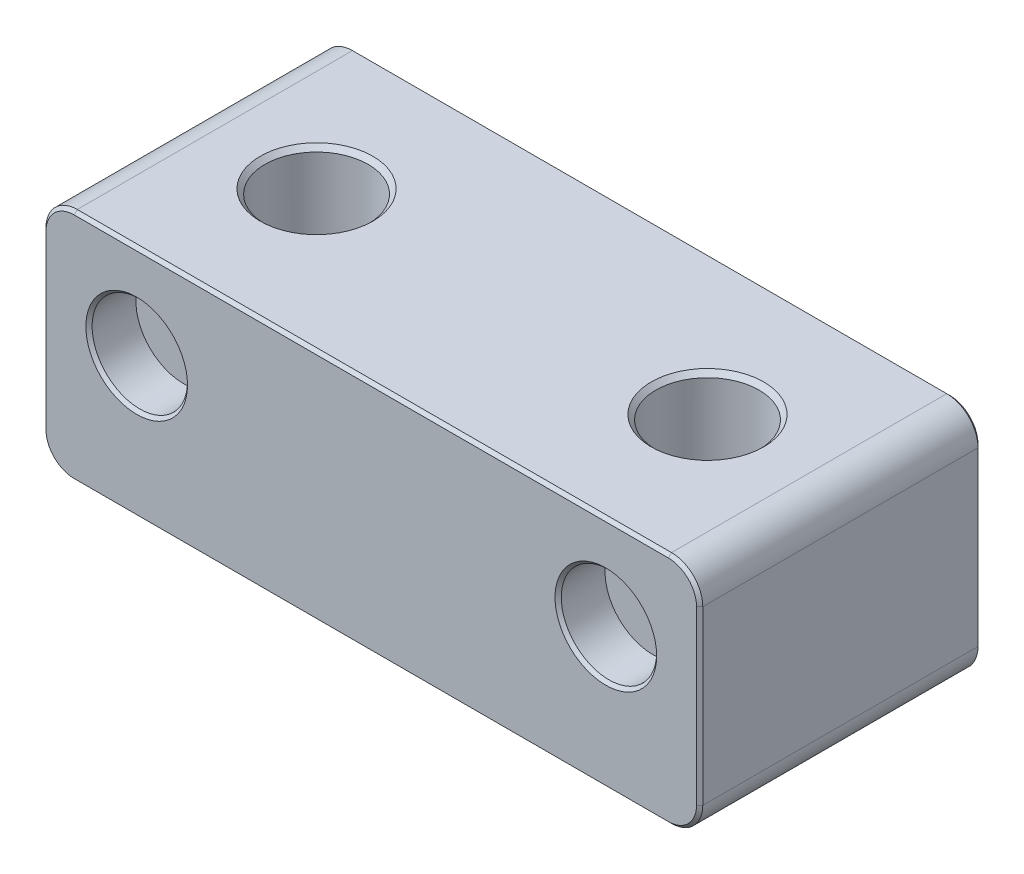
ISO-10303-21;
HEADER;
FILE_DESCRIPTION(('STEP AP214'),'2;1');
FILE_NAME('part.step','',(''),(''),'','','');
FILE_SCHEMA(('AUTOMOTIVE_DESIGN { 1 0 10303 214 1 1 1 1 }'));
ENDSEC;
DATA;
#1=APPLICATION_CONTEXT('core data for automotive mechanical design processes');
#2=APPLICATION_PROTOCOL_DEFINITION('international standard','automotive_design',2000,#1);
#3=PRODUCT_CONTEXT('',#1,'mechanical');
#4=PRODUCT('Part','Part','',(#3));
#5=PRODUCT_RELATED_PRODUCT_CATEGORY('part','',(#4));
#6=PRODUCT_DEFINITION_FORMATION('','',#4);
#7=PRODUCT_DEFINITION_CONTEXT('part definition',#1,'design');
#8=PRODUCT_DEFINITION('design','',#6,#7);
#9=PRODUCT_DEFINITION_SHAPE('','',#8);
#10=(LENGTH_UNIT() NAMED_UNIT(*) SI_UNIT(.MILLI.,.METRE.));
#11=(NAMED_UNIT(*) PLANE_ANGLE_UNIT() SI_UNIT($,.RADIAN.));
#12=(NAMED_UNIT(*) SI_UNIT($,.STERADIAN.) SOLID_ANGLE_UNIT());
#13=UNCERTAINTY_MEASURE_WITH_UNIT(LENGTH_MEASURE(1.E-05),#10,'distance_accuracy_value','');
#14=(GEOMETRIC_REPRESENTATION_CONTEXT(3) GLOBAL_UNCERTAINTY_ASSIGNED_CONTEXT((#13)) GLOBAL_UNIT_ASSIGNED_CONTEXT((#10,
#11,#12)) REPRESENTATION_CONTEXT('',''));
#15=CARTESIAN_POINT('',(0.,0.,0.));
#16=DIRECTION('',(0.,0.,1.));
#17=DIRECTION('',(1.,0.,0.));
#18=AXIS2_PLACEMENT_3D('',#15,#16,#17);
#19=CARTESIAN_POINT('',(0.,0.,9.));
#20=DIRECTION('',(0.,0.,1.));
#21=DIRECTION('',(1.,0.,0.));
#22=AXIS2_PLACEMENT_3D('',#19,#20,#21);
#23=PLANE('',#22);
#24=CARTESIAN_POINT('',(15.,0.,9.));
#25=DIRECTION('',(0.,0.,1.));
#26=DIRECTION('',(1.,0.,0.));
#27=AXIS2_PLACEMENT_3D('',#24,#25,#26);
#28=CIRCLE('',#27,3.25);
#29=CARTESIAN_POINT('',(18.25,0.,9.));
#30=VERTEX_POINT('',#29);
#31=EDGE_CURVE('E215',#30,#30,#28,.F.);
#32=ORIENTED_EDGE('',*,*,#31,.T.);
#33=EDGE_LOOP('',(#32));
#34=FACE_BOUND('',#33,.T.);
#35=DIRECTION('',(0.,-1.,0.));
#36=VECTOR('',#35,1.);
#37=CARTESIAN_POINT('',(-20.8,-7.,9.));
#38=LINE('',#37,#36);
#39=CARTESIAN_POINT('',(-20.8,4.,9.));
#40=VERTEX_POINT('',#39);
#41=CARTESIAN_POINT('',(-20.8,-7.,9.));
#42=VERTEX_POINT('',#41);
#43=EDGE_CURVE('E33',#40,#42,#38,.T.);
#44=ORIENTED_EDGE('',*,*,#43,.T.);
#45=CARTESIAN_POINT('',(-19.,-7.,9.));
#46=DIRECTION('',(0.,0.,1.));
#47=DIRECTION('',(1.,0.,0.));
#48=AXIS2_PLACEMENT_3D('',#45,#46,#47);
#49=CIRCLE('',#48,1.8);
#50=CARTESIAN_POINT('',(-19.,-8.8,9.));
#51=VERTEX_POINT('',#50);
#52=EDGE_CURVE('E213',#42,#51,#49,.T.);
#53=ORIENTED_EDGE('',*,*,#52,.T.);
#54=DIRECTION('',(1.,0.,0.));
#55=VECTOR('',#54,1.);
#56=CARTESIAN_POINT('',(0.,-8.8,9.));
#57=LINE('',#56,#55);
#58=CARTESIAN_POINT('',(19.,-8.8,9.));
#59=VERTEX_POINT('',#58);
#60=EDGE_CURVE('E201',#51,#59,#57,.T.);
#61=ORIENTED_EDGE('',*,*,#60,.T.);
#62=CARTESIAN_POINT('',(19.,-7.,9.));
#63=DIRECTION('',(0.,0.,1.));
#64=DIRECTION('',(1.,0.,0.));
#65=AXIS2_PLACEMENT_3D('',#62,#63,#64);
#66=CIRCLE('',#65,1.8);
#67=CARTESIAN_POINT('',(20.8,-7.,9.));
#68=VERTEX_POINT('',#67);
#69=EDGE_CURVE('E203',#59,#68,#66,.T.);
#70=ORIENTED_EDGE('',*,*,#69,.T.);
#71=DIRECTION('',(0.,1.,0.));
#72=VECTOR('',#71,1.);
#73=CARTESIAN_POINT('',(20.8,4.,9.));
#74=LINE('',#73,#72);
#75=CARTESIAN_POINT('',(20.8,4.,9.));
#76=VERTEX_POINT('',#75);
#77=EDGE_CURVE('E205',#68,#76,#74,.T.);
#78=ORIENTED_EDGE('',*,*,#77,.T.);
#79=CARTESIAN_POINT('',(19.,4.,9.));
#80=DIRECTION('',(0.,0.,1.));
#81=DIRECTION('',(1.,0.,0.));
#82=AXIS2_PLACEMENT_3D('',#79,#80,#81);
#83=CIRCLE('',#82,1.8);
#84=CARTESIAN_POINT('',(19.,5.8,9.));
#85=VERTEX_POINT('',#84);
#86=EDGE_CURVE('E207',#76,#85,#83,.T.);
#87=ORIENTED_EDGE('',*,*,#86,.T.);
#88=DIRECTION('',(-1.,0.,0.));
#89=VECTOR('',#88,1.);
#90=CARTESIAN_POINT('',(-19.,5.8,9.));
#91=LINE('',#90,#89);
#92=CARTESIAN_POINT('',(-19.,5.8,9.));
#93=VERTEX_POINT('',#92);
#94=EDGE_CURVE('E209',#85,#93,#91,.T.);
#95=ORIENTED_EDGE('',*,*,#94,.T.);
#96=CARTESIAN_POINT('',(-19.,4.,9.));
#97=DIRECTION('',(0.,0.,1.));
#98=DIRECTION('',(1.,0.,0.));
#99=AXIS2_PLACEMENT_3D('',#96,#97,#98);
#100=CIRCLE('',#99,1.8);
#101=EDGE_CURVE('E38',#93,#40,#100,.T.);
#102=ORIENTED_EDGE('',*,*,#101,.T.);
#103=EDGE_LOOP('',(#44,#53,#61,#70,#78,#87,#95,#102));
#104=FACE_BOUND('',#103,.T.);
#105=CARTESIAN_POINT('',(-15.,0.,9.));
#106=DIRECTION('',(0.,0.,1.));
#107=DIRECTION('',(1.,0.,0.));
#108=AXIS2_PLACEMENT_3D('',#105,#106,#107);
#109=CIRCLE('',#108,3.25);
#110=CARTESIAN_POINT('',(-11.75,0.,9.));
#111=VERTEX_POINT('',#110);
#112=EDGE_CURVE('E198',#111,#111,#109,.F.);
#113=ORIENTED_EDGE('',*,*,#112,.T.);
#114=EDGE_LOOP('',(#113));
#115=FACE_BOUND('',#114,.T.);
#116=ADVANCED_FACE('F17',(#34,#104,#115),#23,.T.);
#117=CARTESIAN_POINT('',(0.,0.,-9.));
#118=DIRECTION('',(0.,0.,1.));
#119=DIRECTION('',(1.,0.,0.));
#120=AXIS2_PLACEMENT_3D('',#117,#118,#119);
#121=PLANE('',#120);
#122=DIRECTION('',(1.,0.,0.));
#123=VECTOR('',#122,1.);
#124=CARTESIAN_POINT('',(0.,5.8,-9.));
#125=LINE('',#124,#123);
#126=CARTESIAN_POINT('',(-19.,5.8,-9.));
#127=VERTEX_POINT('',#126);
#128=CARTESIAN_POINT('',(19.,5.8,-9.));
#129=VERTEX_POINT('',#128);
#130=EDGE_CURVE('E156',#127,#129,#125,.T.);
#131=ORIENTED_EDGE('',*,*,#130,.T.);
#132=CARTESIAN_POINT('',(19.,4.,-9.));
#133=DIRECTION('',(0.,0.,1.));
#134=DIRECTION('',(1.,0.,0.));
#135=AXIS2_PLACEMENT_3D('',#132,#133,#134);
#136=CIRCLE('',#135,1.8);
#137=CARTESIAN_POINT('',(20.8,4.,-9.));
#138=VERTEX_POINT('',#137);
#139=EDGE_CURVE('E136',#129,#138,#136,.F.);
#140=ORIENTED_EDGE('',*,*,#139,.T.);
#141=DIRECTION('',(0.,-1.,0.));
#142=VECTOR('',#141,1.);
#143=CARTESIAN_POINT('',(20.8,0.,-9.));
#144=LINE('',#143,#142);
#145=CARTESIAN_POINT('',(20.8,-7.,-9.));
#146=VERTEX_POINT('',#145);
#147=EDGE_CURVE('E145',#138,#146,#144,.T.);
#148=ORIENTED_EDGE('',*,*,#147,.T.);
#149=CARTESIAN_POINT('',(19.,-7.,-9.));
#150=DIRECTION('',(0.,0.,1.));
#151=DIRECTION('',(1.,0.,0.));
#152=AXIS2_PLACEMENT_3D('',#149,#150,#151);
#153=CIRCLE('',#152,1.8);
#154=CARTESIAN_POINT('',(19.,-8.8,-9.));
#155=VERTEX_POINT('',#154);
#156=EDGE_CURVE('E151',#146,#155,#153,.F.);
#157=ORIENTED_EDGE('',*,*,#156,.T.);
#158=DIRECTION('',(-1.,0.,0.));
#159=VECTOR('',#158,1.);
#160=CARTESIAN_POINT('',(-19.,-8.8,-9.));
#161=LINE('',#160,#159);
#162=CARTESIAN_POINT('',(-19.,-8.8,-9.));
#163=VERTEX_POINT('',#162);
#164=EDGE_CURVE('E325',#155,#163,#161,.T.);
#165=ORIENTED_EDGE('',*,*,#164,.T.);
#166=CARTESIAN_POINT('',(-19.,-7.,-9.));
#167=DIRECTION('',(0.,0.,1.));
#168=DIRECTION('',(1.,0.,0.));
#169=AXIS2_PLACEMENT_3D('',#166,#167,#168);
#170=CIRCLE('',#169,1.8);
#171=CARTESIAN_POINT('',(-20.8,-7.,-9.));
#172=VERTEX_POINT('',#171);
#173=EDGE_CURVE('E327',#163,#172,#170,.F.);
#174=ORIENTED_EDGE('',*,*,#173,.T.);
#175=DIRECTION('',(0.,1.,0.));
#176=VECTOR('',#175,1.);
#177=CARTESIAN_POINT('',(-20.8,0.,-9.));
#178=LINE('',#177,#176);
#179=CARTESIAN_POINT('',(-20.8,4.,-9.));
#180=VERTEX_POINT('',#179);
#181=EDGE_CURVE('E329',#172,#180,#178,.T.);
#182=ORIENTED_EDGE('',*,*,#181,.T.);
#183=CARTESIAN_POINT('',(-19.,4.,-9.));
#184=DIRECTION('',(0.,0.,1.));
#185=DIRECTION('',(1.,0.,0.));
#186=AXIS2_PLACEMENT_3D('',#183,#184,#185);
#187=CIRCLE('',#186,1.8);
#188=EDGE_CURVE('E161',#180,#127,#187,.F.);
#189=ORIENTED_EDGE('',*,*,#188,.T.);
#190=EDGE_LOOP('',(#131,#140,#148,#157,#165,#174,#182,#189));
#191=FACE_BOUND('',#190,.T.);
#192=ADVANCED_FACE('F154',(#191),#121,.F.);
#193=CARTESIAN_POINT('',(-21.,6.,9.));
#194=DIRECTION('',(1.,0.,0.));
#195=DIRECTION('',(0.,0.,-1.));
#196=AXIS2_PLACEMENT_3D('',#193,#194,#195);
#197=PLANE('',#196);
#198=DIRECTION('',(0.,0.,-1.));
#199=VECTOR('',#198,1.);
#200=CARTESIAN_POINT('',(-21.,4.,9.));
#201=LINE('',#200,#199);
#202=CARTESIAN_POINT('',(-21.,4.,8.8));
#203=VERTEX_POINT('',#202);
#204=CARTESIAN_POINT('',(-21.,4.,-8.8));
#205=VERTEX_POINT('',#204);
#206=EDGE_CURVE('E349',#203,#205,#201,.T.);
#207=ORIENTED_EDGE('',*,*,#206,.T.);
#208=DIRECTION('',(0.,-1.,0.));
#209=VECTOR('',#208,1.);
#210=CARTESIAN_POINT('',(-21.,6.,-8.8));
#211=LINE('',#210,#209);
#212=CARTESIAN_POINT('',(-21.,-7.,-8.8));
#213=VERTEX_POINT('',#212);
#214=EDGE_CURVE('E176',#205,#213,#211,.T.);
#215=ORIENTED_EDGE('',*,*,#214,.T.);
#216=DIRECTION('',(0.,0.,-1.));
#217=VECTOR('',#216,1.);
#218=CARTESIAN_POINT('',(-21.,-7.,9.));
#219=LINE('',#218,#217);
#220=CARTESIAN_POINT('',(-21.,-7.,8.8));
#221=VERTEX_POINT('',#220);
#222=EDGE_CURVE('E320',#213,#221,#219,.F.);
#223=ORIENTED_EDGE('',*,*,#222,.T.);
#224=DIRECTION('',(0.,1.,0.));
#225=VECTOR('',#224,1.);
#226=CARTESIAN_POINT('',(-21.,4.,8.8));
#227=LINE('',#226,#225);
#228=EDGE_CURVE('E174',#221,#203,#227,.T.);
#229=ORIENTED_EDGE('',*,*,#228,.T.);
#230=EDGE_LOOP('',(#207,#215,#223,#229));
#231=FACE_BOUND('',#230,.T.);
#232=ADVANCED_FACE('F360',(#231),#197,.F.);
#233=CARTESIAN_POINT('',(21.,6.,9.));
#234=DIRECTION('',(-1.,0.,0.));
#235=DIRECTION('',(0.,-1.,0.));
#236=AXIS2_PLACEMENT_3D('',#233,#234,#235);
#237=PLANE('',#236);
#238=DIRECTION('',(0.,0.,1.));
#239=VECTOR('',#238,1.);
#240=CARTESIAN_POINT('',(21.,-7.,-9.));
#241=LINE('',#240,#239);
#242=CARTESIAN_POINT('',(21.,-7.,8.8));
#243=VERTEX_POINT('',#242);
#244=CARTESIAN_POINT('',(21.,-7.,-8.8));
#245=VERTEX_POINT('',#244);
#246=EDGE_CURVE('E345',#243,#245,#241,.F.);
#247=ORIENTED_EDGE('',*,*,#246,.T.);
#248=DIRECTION('',(0.,1.,0.));
#249=VECTOR('',#248,1.);
#250=CARTESIAN_POINT('',(21.,6.,-8.8));
#251=LINE('',#250,#249);
#252=CARTESIAN_POINT('',(21.,4.,-8.8));
#253=VERTEX_POINT('',#252);
#254=EDGE_CURVE('E193',#245,#253,#251,.T.);
#255=ORIENTED_EDGE('',*,*,#254,.T.);
#256=DIRECTION('',(0.,0.,-1.));
#257=VECTOR('',#256,1.);
#258=CARTESIAN_POINT('',(21.,4.,9.));
#259=LINE('',#258,#257);
#260=CARTESIAN_POINT('',(21.,4.,8.8));
#261=VERTEX_POINT('',#260);
#262=EDGE_CURVE('E342',#253,#261,#259,.F.);
#263=ORIENTED_EDGE('',*,*,#262,.T.);
#264=DIRECTION('',(0.,-1.,0.));
#265=VECTOR('',#264,1.);
#266=CARTESIAN_POINT('',(21.,-7.,8.8));
#267=LINE('',#266,#265);
#268=EDGE_CURVE('E191',#261,#243,#267,.T.);
#269=ORIENTED_EDGE('',*,*,#268,.T.);
#270=EDGE_LOOP('',(#247,#255,#263,#269));
#271=FACE_BOUND('',#270,.T.);
#272=ADVANCED_FACE('F306',(#271),#237,.F.);
#273=CARTESIAN_POINT('',(-21.,6.,9.));
#274=DIRECTION('',(0.,-1.,0.));
#275=DIRECTION('',(1.,0.,0.));
#276=AXIS2_PLACEMENT_3D('',#273,#274,#275);
#277=PLANE('',#276);
#278=CARTESIAN_POINT('',(12.5,6.,0.));
#279=DIRECTION('',(0.,-1.,0.));
#280=DIRECTION('',(1.,0.,0.));
#281=AXIS2_PLACEMENT_3D('',#278,#279,#280);
#282=CIRCLE('',#281,3.6);
#283=CARTESIAN_POINT('',(16.1,6.,0.));
#284=VERTEX_POINT('',#283);
#285=EDGE_CURVE('E288',#284,#284,#282,.T.);
#286=ORIENTED_EDGE('',*,*,#285,.T.);
#287=EDGE_LOOP('',(#286));
#288=FACE_BOUND('',#287,.T.);
#289=CARTESIAN_POINT('',(-12.5,6.,0.));
#290=DIRECTION('',(0.,-1.,0.));
#291=DIRECTION('',(1.,0.,0.));
#292=AXIS2_PLACEMENT_3D('',#289,#290,#291);
#293=CIRCLE('',#292,3.6);
#294=CARTESIAN_POINT('',(-8.9,6.,0.));
#295=VERTEX_POINT('',#294);
#296=EDGE_CURVE('E285',#295,#295,#293,.T.);
#297=ORIENTED_EDGE('',*,*,#296,.T.);
#298=EDGE_LOOP('',(#297));
#299=FACE_BOUND('',#298,.T.);
#300=DIRECTION('',(0.,0.,-1.));
#301=VECTOR('',#300,1.);
#302=CARTESIAN_POINT('',(19.,6.,9.));
#303=LINE('',#302,#301);
#304=CARTESIAN_POINT('',(19.,6.,8.8));
#305=VERTEX_POINT('',#304);
#306=CARTESIAN_POINT('',(19.,6.,-8.8));
#307=VERTEX_POINT('',#306);
#308=EDGE_CURVE('E152',#305,#307,#303,.T.);
#309=ORIENTED_EDGE('',*,*,#308,.T.);
#310=DIRECTION('',(-1.,0.,0.));
#311=VECTOR('',#310,1.);
#312=CARTESIAN_POINT('',(-21.,6.,-8.8));
#313=LINE('',#312,#311);
#314=CARTESIAN_POINT('',(-19.,6.,-8.8));
#315=VERTEX_POINT('',#314);
#316=EDGE_CURVE('E168',#307,#315,#313,.T.);
#317=ORIENTED_EDGE('',*,*,#316,.T.);
#318=DIRECTION('',(0.,0.,-1.));
#319=VECTOR('',#318,1.);
#320=CARTESIAN_POINT('',(-19.,6.,9.));
#321=LINE('',#320,#319);
#322=CARTESIAN_POINT('',(-19.,6.,8.8));
#323=VERTEX_POINT('',#322);
#324=EDGE_CURVE('E318',#315,#323,#321,.F.);
#325=ORIENTED_EDGE('',*,*,#324,.T.);
#326=DIRECTION('',(1.,0.,0.));
#327=VECTOR('',#326,1.);
#328=CARTESIAN_POINT('',(19.,6.,8.8));
#329=LINE('',#328,#327);
#330=EDGE_CURVE('E166',#323,#305,#329,.T.);
#331=ORIENTED_EDGE('',*,*,#330,.T.);
#332=EDGE_LOOP('',(#309,#317,#325,#331));
#333=FACE_BOUND('',#332,.T.);
#334=ADVANCED_FACE('F302',(#288,#299,#333),#277,.F.);
#335=CARTESIAN_POINT('',(-15.,0.,9.));
#336=DIRECTION('',(0.,0.,-1.));
#337=DIRECTION('',(-1.,0.,0.));
#338=AXIS2_PLACEMENT_3D('',#335,#336,#337);
#339=CYLINDRICAL_SURFACE('',#338,3.05);
#340=CARTESIAN_POINT('',(-15.,0.,8.8));
#341=DIRECTION('',(0.,0.,1.));
#342=DIRECTION('',(1.,0.,0.));
#343=AXIS2_PLACEMENT_3D('',#340,#341,#342);
#344=CIRCLE('',#343,3.05);
#345=CARTESIAN_POINT('',(-11.95,0.,8.8));
#346=VERTEX_POINT('',#345);
#347=EDGE_CURVE('E218',#346,#346,#344,.T.);
#348=ORIENTED_EDGE('',*,*,#347,.T.);
#349=EDGE_LOOP('',(#348));
#350=FACE_BOUND('',#349,.T.);
#351=CARTESIAN_POINT('',(-15.,0.,6.));
#352=DIRECTION('',(0.,0.,1.));
#353=DIRECTION('',(1.,0.,0.));
#354=AXIS2_PLACEMENT_3D('',#351,#352,#353);
#355=CIRCLE('',#354,3.05);
#356=CARTESIAN_POINT('',(-11.95,0.,6.));
#357=VERTEX_POINT('',#356);
#358=EDGE_CURVE('E606',#357,#357,#355,.T.);
#359=ORIENTED_EDGE('',*,*,#358,.F.);
#360=EDGE_LOOP('',(#359));
#361=FACE_BOUND('',#360,.T.);
#362=ADVANCED_FACE('F305',(#350,#361),#339,.F.);
#363=CARTESIAN_POINT('',(15.,0.,9.));
#364=DIRECTION('',(0.,0.,-1.));
#365=DIRECTION('',(-1.,0.,0.));
#366=AXIS2_PLACEMENT_3D('',#363,#364,#365);
#367=CYLINDRICAL_SURFACE('',#366,3.05);
#368=CARTESIAN_POINT('',(15.,0.,8.8));
#369=DIRECTION('',(0.,0.,1.));
#370=DIRECTION('',(1.,0.,0.));
#371=AXIS2_PLACEMENT_3D('',#368,#369,#370);
#372=CIRCLE('',#371,3.05);
#373=CARTESIAN_POINT('',(18.05,0.,8.8));
#374=VERTEX_POINT('',#373);
#375=EDGE_CURVE('E195',#374,#374,#372,.T.);
#376=ORIENTED_EDGE('',*,*,#375,.T.);
#377=EDGE_LOOP('',(#376));
#378=FACE_BOUND('',#377,.T.);
#379=CARTESIAN_POINT('',(15.,0.,6.));
#380=DIRECTION('',(0.,0.,1.));
#381=DIRECTION('',(1.,0.,0.));
#382=AXIS2_PLACEMENT_3D('',#379,#380,#381);
#383=CIRCLE('',#382,3.05);
#384=CARTESIAN_POINT('',(18.05,0.,6.));
#385=VERTEX_POINT('',#384);
#386=EDGE_CURVE('E239',#385,#385,#383,.T.);
#387=ORIENTED_EDGE('',*,*,#386,.F.);
#388=EDGE_LOOP('',(#387));
#389=FACE_BOUND('',#388,.T.);
#390=ADVANCED_FACE('F593',(#378,#389),#367,.F.);
#391=CARTESIAN_POINT('',(15.,0.,6.));
#392=DIRECTION('',(0.,0.,1.));
#393=DIRECTION('',(1.,0.,0.));
#394=AXIS2_PLACEMENT_3D('',#391,#392,#393);
#395=PLANE('',#394);
#396=ORIENTED_EDGE('',*,*,#386,.T.);
#397=EDGE_LOOP('',(#396));
#398=FACE_BOUND('',#397,.T.);
#399=ADVANCED_FACE('F590',(#398),#395,.T.);
#400=CARTESIAN_POINT('',(-15.,0.,6.));
#401=DIRECTION('',(0.,0.,1.));
#402=DIRECTION('',(1.,0.,0.));
#403=AXIS2_PLACEMENT_3D('',#400,#401,#402);
#404=PLANE('',#403);
#405=ORIENTED_EDGE('',*,*,#358,.T.);
#406=EDGE_LOOP('',(#405));
#407=FACE_BOUND('',#406,.T.);
#408=ADVANCED_FACE('F586',(#407),#404,.T.);
#409=CARTESIAN_POINT('',(0.,-9.,0.));
#410=DIRECTION('',(0.,-1.,0.));
#411=DIRECTION('',(0.,0.,-1.));
#412=AXIS2_PLACEMENT_3D('',#409,#410,#411);
#413=PLANE('',#412);
#414=CARTESIAN_POINT('',(12.5,-9.,0.));
#415=DIRECTION('',(0.,-1.,0.));
#416=DIRECTION('',(0.,0.,-1.));
#417=AXIS2_PLACEMENT_3D('',#414,#415,#416);
#418=CIRCLE('',#417,1.95);
#419=CARTESIAN_POINT('',(12.5,-9.,-1.95));
#420=VERTEX_POINT('',#419);
#421=EDGE_CURVE('E264',#420,#420,#418,.F.);
#422=ORIENTED_EDGE('',*,*,#421,.T.);
#423=EDGE_LOOP('',(#422));
#424=FACE_BOUND('',#423,.T.);
#425=CARTESIAN_POINT('',(-12.5,-9.,0.));
#426=DIRECTION('',(0.,-1.,0.));
#427=DIRECTION('',(0.,0.,-1.));
#428=AXIS2_PLACEMENT_3D('',#425,#426,#427);
#429=CIRCLE('',#428,1.95);
#430=CARTESIAN_POINT('',(-12.5,-9.,-1.95));
#431=VERTEX_POINT('',#430);
#432=EDGE_CURVE('E220',#431,#431,#429,.F.);
#433=ORIENTED_EDGE('',*,*,#432,.T.);
#434=EDGE_LOOP('',(#433));
#435=FACE_BOUND('',#434,.T.);
#436=DIRECTION('',(0.,0.,-1.));
#437=VECTOR('',#436,1.);
#438=CARTESIAN_POINT('',(-19.,-9.,-9.));
#439=LINE('',#438,#437);
#440=CARTESIAN_POINT('',(-19.,-9.,8.8));
#441=VERTEX_POINT('',#440);
#442=CARTESIAN_POINT('',(-19.,-9.,-8.8));
#443=VERTEX_POINT('',#442);
#444=EDGE_CURVE('E352',#441,#443,#439,.T.);
#445=ORIENTED_EDGE('',*,*,#444,.T.);
#446=DIRECTION('',(1.,0.,0.));
#447=VECTOR('',#446,1.);
#448=CARTESIAN_POINT('',(19.,-9.,-8.8));
#449=LINE('',#448,#447);
#450=CARTESIAN_POINT('',(19.,-9.,-8.8));
#451=VERTEX_POINT('',#450);
#452=EDGE_CURVE('E185',#443,#451,#449,.T.);
#453=ORIENTED_EDGE('',*,*,#452,.T.);
#454=DIRECTION('',(0.,0.,1.));
#455=VECTOR('',#454,1.);
#456=CARTESIAN_POINT('',(19.,-9.,9.));
#457=LINE('',#456,#455);
#458=CARTESIAN_POINT('',(19.,-9.,8.8));
#459=VERTEX_POINT('',#458);
#460=EDGE_CURVE('E346',#451,#459,#457,.T.);
#461=ORIENTED_EDGE('',*,*,#460,.T.);
#462=DIRECTION('',(-1.,0.,0.));
#463=VECTOR('',#462,1.);
#464=CARTESIAN_POINT('',(0.,-9.,8.8));
#465=LINE('',#464,#463);
#466=EDGE_CURVE('E183',#459,#441,#465,.T.);
#467=ORIENTED_EDGE('',*,*,#466,.T.);
#468=EDGE_LOOP('',(#445,#453,#461,#467));
#469=FACE_BOUND('',#468,.T.);
#470=ADVANCED_FACE('F410',(#424,#435,#469),#413,.T.);
#471=CARTESIAN_POINT('',(19.,-7.,0.));
#472=DIRECTION('',(0.,0.,-1.));
#473=DIRECTION('',(-1.,0.,0.));
#474=AXIS2_PLACEMENT_3D('',#471,#472,#473);
#475=CYLINDRICAL_SURFACE('',#474,2.);
#476=ORIENTED_EDGE('',*,*,#460,.F.);
#477=CARTESIAN_POINT('',(19.,-7.,-8.8));
#478=DIRECTION('',(0.,0.,1.));
#479=DIRECTION('',(1.,0.,0.));
#480=AXIS2_PLACEMENT_3D('',#477,#478,#479);
#481=CIRCLE('',#480,2.);
#482=EDGE_CURVE('E189',#451,#245,#481,.T.);
#483=ORIENTED_EDGE('',*,*,#482,.T.);
#484=ORIENTED_EDGE('',*,*,#246,.F.);
#485=CARTESIAN_POINT('',(19.,-7.,8.8));
#486=DIRECTION('',(0.,0.,1.));
#487=DIRECTION('',(1.,0.,0.));
#488=AXIS2_PLACEMENT_3D('',#485,#486,#487);
#489=CIRCLE('',#488,2.);
#490=EDGE_CURVE('E187',#243,#459,#489,.F.);
#491=ORIENTED_EDGE('',*,*,#490,.T.);
#492=EDGE_LOOP('',(#476,#483,#484,#491));
#493=FACE_BOUND('',#492,.T.);
#494=ADVANCED_FACE('F407',(#493),#475,.T.);
#495=CARTESIAN_POINT('',(-19.,-7.,0.));
#496=DIRECTION('',(0.,0.,1.));
#497=DIRECTION('',(1.,0.,0.));
#498=AXIS2_PLACEMENT_3D('',#495,#496,#497);
#499=CYLINDRICAL_SURFACE('',#498,2.);
#500=ORIENTED_EDGE('',*,*,#222,.F.);
#501=CARTESIAN_POINT('',(-19.,-7.,-8.8));
#502=DIRECTION('',(0.,0.,1.));
#503=DIRECTION('',(1.,0.,0.));
#504=AXIS2_PLACEMENT_3D('',#501,#502,#503);
#505=CIRCLE('',#504,2.);
#506=EDGE_CURVE('E181',#213,#443,#505,.T.);
#507=ORIENTED_EDGE('',*,*,#506,.T.);
#508=ORIENTED_EDGE('',*,*,#444,.F.);
#509=CARTESIAN_POINT('',(-19.,-7.,8.8));
#510=DIRECTION('',(0.,0.,1.));
#511=DIRECTION('',(1.,0.,0.));
#512=AXIS2_PLACEMENT_3D('',#509,#510,#511);
#513=CIRCLE('',#512,2.);
#514=EDGE_CURVE('E178',#441,#221,#513,.F.);
#515=ORIENTED_EDGE('',*,*,#514,.T.);
#516=EDGE_LOOP('',(#500,#507,#508,#515));
#517=FACE_BOUND('',#516,.T.);
#518=ADVANCED_FACE('F366',(#517),#499,.T.);
#519=CARTESIAN_POINT('',(19.,4.,9.));
#520=DIRECTION('',(0.,0.,-1.));
#521=DIRECTION('',(-1.,0.,0.));
#522=AXIS2_PLACEMENT_3D('',#519,#520,#521);
#523=CYLINDRICAL_SURFACE('',#522,2.);
#524=ORIENTED_EDGE('',*,*,#262,.F.);
#525=CARTESIAN_POINT('',(19.,4.,-8.8));
#526=DIRECTION('',(0.,0.,1.));
#527=DIRECTION('',(1.,0.,0.));
#528=AXIS2_PLACEMENT_3D('',#525,#526,#527);
#529=CIRCLE('',#528,2.);
#530=EDGE_CURVE('E138',#253,#307,#529,.T.);
#531=ORIENTED_EDGE('',*,*,#530,.T.);
#532=ORIENTED_EDGE('',*,*,#308,.F.);
#533=CARTESIAN_POINT('',(19.,4.,8.8));
#534=DIRECTION('',(0.,0.,1.));
#535=DIRECTION('',(1.,0.,0.));
#536=AXIS2_PLACEMENT_3D('',#533,#534,#535);
#537=CIRCLE('',#536,2.);
#538=EDGE_CURVE('E158',#305,#261,#537,.F.);
#539=ORIENTED_EDGE('',*,*,#538,.T.);
#540=EDGE_LOOP('',(#524,#531,#532,#539));
#541=FACE_BOUND('',#540,.T.);
#542=ADVANCED_FACE('F340',(#541),#523,.T.);
#543=CARTESIAN_POINT('',(-19.,4.,9.));
#544=DIRECTION('',(0.,0.,-1.));
#545=DIRECTION('',(-1.,0.,0.));
#546=AXIS2_PLACEMENT_3D('',#543,#544,#545);
#547=CYLINDRICAL_SURFACE('',#546,2.);
#548=ORIENTED_EDGE('',*,*,#324,.F.);
#549=CARTESIAN_POINT('',(-19.,4.,-8.8));
#550=DIRECTION('',(0.,0.,1.));
#551=DIRECTION('',(1.,0.,0.));
#552=AXIS2_PLACEMENT_3D('',#549,#550,#551);
#553=CIRCLE('',#552,2.);
#554=EDGE_CURVE('E172',#315,#205,#553,.T.);
#555=ORIENTED_EDGE('',*,*,#554,.T.);
#556=ORIENTED_EDGE('',*,*,#206,.F.);
#557=CARTESIAN_POINT('',(-19.,4.,8.8));
#558=DIRECTION('',(0.,0.,1.));
#559=DIRECTION('',(1.,0.,0.));
#560=AXIS2_PLACEMENT_3D('',#557,#558,#559);
#561=CIRCLE('',#560,2.);
#562=EDGE_CURVE('E170',#203,#323,#561,.F.);
#563=ORIENTED_EDGE('',*,*,#562,.T.);
#564=EDGE_LOOP('',(#548,#555,#556,#563));
#565=FACE_BOUND('',#564,.T.);
#566=ADVANCED_FACE('F389',(#565),#547,.T.);
#567=CARTESIAN_POINT('',(-19.,-7.,-9.));
#568=DIRECTION('',(0.,0.,1.));
#569=DIRECTION('',(1.,0.,0.));
#570=AXIS2_PLACEMENT_3D('',#567,#568,#569);
#571=CONICAL_SURFACE('',#570,1.8,0.785398163397444);
#572=DIRECTION('',(0.,0.707106781186545,-0.707106781186551));
#573=VECTOR('',#572,1.);
#574=CARTESIAN_POINT('',(-19.,-9.,-8.8));
#575=LINE('',#574,#573);
#576=EDGE_CURVE('E233',#443,#163,#575,.T.);
#577=ORIENTED_EDGE('',*,*,#576,.F.);
#578=ORIENTED_EDGE('',*,*,#506,.F.);
#579=DIRECTION('',(-0.707106781186548,0.,0.707106781186548));
#580=VECTOR('',#579,1.);
#581=CARTESIAN_POINT('',(-20.8,-7.,-9.));
#582=LINE('',#581,#580);
#583=EDGE_CURVE('E236',#172,#213,#582,.T.);
#584=ORIENTED_EDGE('',*,*,#583,.F.);
#585=ORIENTED_EDGE('',*,*,#173,.F.);
#586=EDGE_LOOP('',(#577,#578,#584,#585));
#587=FACE_BOUND('',#586,.T.);
#588=ADVANCED_FACE('F373',(#587),#571,.T.);
#589=CARTESIAN_POINT('',(-21.,6.,-8.8));
#590=DIRECTION('',(0.707106781186548,0.,0.707106781186548));
#591=DIRECTION('',(0.,-1.,0.));
#592=AXIS2_PLACEMENT_3D('',#589,#590,#591);
#593=PLANE('',#592);
#594=ORIENTED_EDGE('',*,*,#583,.T.);
#595=ORIENTED_EDGE('',*,*,#214,.F.);
#596=DIRECTION('',(-0.707106781186548,0.,0.707106781186548));
#597=VECTOR('',#596,1.);
#598=CARTESIAN_POINT('',(-20.8,4.,-9.));
#599=LINE('',#598,#597);
#600=EDGE_CURVE('E230',#180,#205,#599,.T.);
#601=ORIENTED_EDGE('',*,*,#600,.F.);
#602=ORIENTED_EDGE('',*,*,#181,.F.);
#603=EDGE_LOOP('',(#594,#595,#601,#602));
#604=FACE_BOUND('',#603,.T.);
#605=ADVANCED_FACE('F377',(#604),#593,.F.);
#606=CARTESIAN_POINT('',(0.,-9.,-8.8));
#607=DIRECTION('',(0.,-0.707106781186548,-0.707106781186548));
#608=DIRECTION('',(-1.,0.,0.));
#609=AXIS2_PLACEMENT_3D('',#606,#607,#608);
#610=PLANE('',#609);
#611=ORIENTED_EDGE('',*,*,#576,.T.);
#612=ORIENTED_EDGE('',*,*,#164,.F.);
#613=DIRECTION('',(0.,0.707106781186548,-0.707106781186548));
#614=VECTOR('',#613,1.);
#615=CARTESIAN_POINT('',(19.,-9.,-8.8));
#616=LINE('',#615,#614);
#617=EDGE_CURVE('E227',#451,#155,#616,.T.);
#618=ORIENTED_EDGE('',*,*,#617,.F.);
#619=ORIENTED_EDGE('',*,*,#452,.F.);
#620=EDGE_LOOP('',(#611,#612,#618,#619));
#621=FACE_BOUND('',#620,.T.);
#622=ADVANCED_FACE('F379',(#621),#610,.T.);
#623=CARTESIAN_POINT('',(-19.,4.,-9.));
#624=DIRECTION('',(0.,0.,1.));
#625=DIRECTION('',(1.,0.,0.));
#626=AXIS2_PLACEMENT_3D('',#623,#624,#625);
#627=CONICAL_SURFACE('',#626,1.8,0.785398163397448);
#628=ORIENTED_EDGE('',*,*,#600,.T.);
#629=ORIENTED_EDGE('',*,*,#554,.F.);
#630=DIRECTION('',(0.,0.707106781186548,0.707106781186548));
#631=VECTOR('',#630,1.);
#632=CARTESIAN_POINT('',(-19.,5.8,-9.));
#633=LINE('',#632,#631);
#634=EDGE_CURVE('E224',#127,#315,#633,.T.);
#635=ORIENTED_EDGE('',*,*,#634,.F.);
#636=ORIENTED_EDGE('',*,*,#188,.F.);
#637=EDGE_LOOP('',(#628,#629,#635,#636));
#638=FACE_BOUND('',#637,.T.);
#639=ADVANCED_FACE('F336',(#638),#627,.T.);
#640=CARTESIAN_POINT('',(19.,-7.,-9.));
#641=DIRECTION('',(0.,0.,1.));
#642=DIRECTION('',(1.,0.,0.));
#643=AXIS2_PLACEMENT_3D('',#640,#641,#642);
#644=CONICAL_SURFACE('',#643,1.8,0.785398163397448);
#645=ORIENTED_EDGE('',*,*,#617,.T.);
#646=ORIENTED_EDGE('',*,*,#156,.F.);
#647=DIRECTION('',(-0.707106781186548,0.,-0.707106781186548));
#648=VECTOR('',#647,1.);
#649=CARTESIAN_POINT('',(21.,-7.,-8.8));
#650=LINE('',#649,#648);
#651=EDGE_CURVE('E148',#245,#146,#650,.T.);
#652=ORIENTED_EDGE('',*,*,#651,.F.);
#653=ORIENTED_EDGE('',*,*,#482,.F.);
#654=EDGE_LOOP('',(#645,#646,#652,#653));
#655=FACE_BOUND('',#654,.T.);
#656=ADVANCED_FACE('F438',(#655),#644,.T.);
#657=CARTESIAN_POINT('',(-21.,6.,-8.8));
#658=DIRECTION('',(0.,-0.707106781186548,0.707106781186547));
#659=DIRECTION('',(-1.,0.,0.));
#660=AXIS2_PLACEMENT_3D('',#657,#658,#659);
#661=PLANE('',#660);
#662=ORIENTED_EDGE('',*,*,#634,.T.);
#663=ORIENTED_EDGE('',*,*,#316,.F.);
#664=DIRECTION('',(0.,0.707106781186546,0.707106781186549));
#665=VECTOR('',#664,1.);
#666=CARTESIAN_POINT('',(19.,5.8,-9.));
#667=LINE('',#666,#665);
#668=EDGE_CURVE('E141',#129,#307,#667,.T.);
#669=ORIENTED_EDGE('',*,*,#668,.F.);
#670=ORIENTED_EDGE('',*,*,#130,.F.);
#671=EDGE_LOOP('',(#662,#663,#669,#670));
#672=FACE_BOUND('',#671,.T.);
#673=ADVANCED_FACE('F338',(#672),#661,.F.);
#674=CARTESIAN_POINT('',(21.,6.,-8.8));
#675=DIRECTION('',(-0.707106781186545,0.,0.707106781186551));
#676=DIRECTION('',(0.,1.,0.));
#677=AXIS2_PLACEMENT_3D('',#674,#675,#676);
#678=PLANE('',#677);
#679=ORIENTED_EDGE('',*,*,#651,.T.);
#680=ORIENTED_EDGE('',*,*,#147,.F.);
#681=DIRECTION('',(-0.707106781186548,0.,-0.707106781186548));
#682=VECTOR('',#681,1.);
#683=CARTESIAN_POINT('',(21.,4.,-8.8));
#684=LINE('',#683,#682);
#685=EDGE_CURVE('E132',#253,#138,#684,.T.);
#686=ORIENTED_EDGE('',*,*,#685,.F.);
#687=ORIENTED_EDGE('',*,*,#254,.F.);
#688=EDGE_LOOP('',(#679,#680,#686,#687));
#689=FACE_BOUND('',#688,.T.);
#690=ADVANCED_FACE('F146',(#689),#678,.F.);
#691=CARTESIAN_POINT('',(19.,4.,-9.));
#692=DIRECTION('',(0.,0.,1.));
#693=DIRECTION('',(1.,0.,0.));
#694=AXIS2_PLACEMENT_3D('',#691,#692,#693);
#695=CONICAL_SURFACE('',#694,1.8,0.785398163397444);
#696=ORIENTED_EDGE('',*,*,#668,.T.);
#697=ORIENTED_EDGE('',*,*,#530,.F.);
#698=ORIENTED_EDGE('',*,*,#685,.T.);
#699=ORIENTED_EDGE('',*,*,#139,.F.);
#700=EDGE_LOOP('',(#696,#697,#698,#699));
#701=FACE_BOUND('',#700,.T.);
#702=ADVANCED_FACE('F134',(#701),#695,.T.);
#703=CARTESIAN_POINT('',(15.,0.,8.8));
#704=DIRECTION('',(0.,0.,1.));
#705=DIRECTION('',(1.,0.,0.));
#706=AXIS2_PLACEMENT_3D('',#703,#704,#705);
#707=CONICAL_SURFACE('',#706,3.05,0.785398163397438);
#708=ORIENTED_EDGE('',*,*,#31,.F.);
#709=EDGE_LOOP('',(#708));
#710=FACE_BOUND('',#709,.T.);
#711=ORIENTED_EDGE('',*,*,#375,.F.);
#712=EDGE_LOOP('',(#711));
#713=FACE_BOUND('',#712,.T.);
#714=ADVANCED_FACE('F427',(#710,#713),#707,.F.);
#715=CARTESIAN_POINT('',(19.,4.,9.));
#716=DIRECTION('',(0.,0.,-1.));
#717=DIRECTION('',(-1.,0.,0.));
#718=AXIS2_PLACEMENT_3D('',#715,#716,#717);
#719=CONICAL_SURFACE('',#718,1.8,0.785398163397444);
#720=DIRECTION('',(-0.707106781186548,0.,0.707106781186548));
#721=VECTOR('',#720,1.);
#722=CARTESIAN_POINT('',(21.,4.,8.8));
#723=LINE('',#722,#721);
#724=EDGE_CURVE('E257',#261,#76,#723,.T.);
#725=ORIENTED_EDGE('',*,*,#724,.F.);
#726=ORIENTED_EDGE('',*,*,#538,.F.);
#727=DIRECTION('',(0.,0.707106781186545,-0.707106781186551));
#728=VECTOR('',#727,1.);
#729=CARTESIAN_POINT('',(19.,5.8,9.));
#730=LINE('',#729,#728);
#731=EDGE_CURVE('E142',#85,#305,#730,.T.);
#732=ORIENTED_EDGE('',*,*,#731,.F.);
#733=ORIENTED_EDGE('',*,*,#86,.F.);
#734=EDGE_LOOP('',(#725,#726,#732,#733));
#735=FACE_BOUND('',#734,.T.);
#736=ADVANCED_FACE('F464',(#735),#719,.T.);
#737=CARTESIAN_POINT('',(0.,5.8,9.));
#738=DIRECTION('',(0.,0.707106781186548,0.707106781186547));
#739=DIRECTION('',(1.,0.,0.));
#740=AXIS2_PLACEMENT_3D('',#737,#738,#739);
#741=PLANE('',#740);
#742=ORIENTED_EDGE('',*,*,#731,.T.);
#743=ORIENTED_EDGE('',*,*,#330,.F.);
#744=DIRECTION('',(0.,0.707106781186548,-0.707106781186548));
#745=VECTOR('',#744,1.);
#746=CARTESIAN_POINT('',(-19.,5.8,9.));
#747=LINE('',#746,#745);
#748=EDGE_CURVE('E254',#93,#323,#747,.T.);
#749=ORIENTED_EDGE('',*,*,#748,.F.);
#750=ORIENTED_EDGE('',*,*,#94,.F.);
#751=EDGE_LOOP('',(#742,#743,#749,#750));
#752=FACE_BOUND('',#751,.T.);
#753=ADVANCED_FACE('F510',(#752),#741,.T.);
#754=CARTESIAN_POINT('',(20.8,0.,9.));
#755=DIRECTION('',(0.707106781186545,0.,0.707106781186551));
#756=DIRECTION('',(0.,-1.,0.));
#757=AXIS2_PLACEMENT_3D('',#754,#755,#756);
#758=PLANE('',#757);
#759=ORIENTED_EDGE('',*,*,#724,.T.);
#760=ORIENTED_EDGE('',*,*,#77,.F.);
#761=DIRECTION('',(-0.707106781186548,0.,0.707106781186548));
#762=VECTOR('',#761,1.);
#763=CARTESIAN_POINT('',(21.,-7.,8.8));
#764=LINE('',#763,#762);
#765=EDGE_CURVE('E251',#243,#68,#764,.T.);
#766=ORIENTED_EDGE('',*,*,#765,.F.);
#767=ORIENTED_EDGE('',*,*,#268,.F.);
#768=EDGE_LOOP('',(#759,#760,#766,#767));
#769=FACE_BOUND('',#768,.T.);
#770=ADVANCED_FACE('F503',(#769),#758,.T.);
#771=CARTESIAN_POINT('',(-19.,4.,9.));
#772=DIRECTION('',(0.,0.,-1.));
#773=DIRECTION('',(-1.,0.,0.));
#774=AXIS2_PLACEMENT_3D('',#771,#772,#773);
#775=CONICAL_SURFACE('',#774,1.8,0.785398163397448);
#776=ORIENTED_EDGE('',*,*,#748,.T.);
#777=ORIENTED_EDGE('',*,*,#562,.F.);
#778=DIRECTION('',(-0.707106781186548,0.,-0.707106781186548));
#779=VECTOR('',#778,1.);
#780=CARTESIAN_POINT('',(-20.8,4.,9.));
#781=LINE('',#780,#779);
#782=EDGE_CURVE('E248',#40,#203,#781,.T.);
#783=ORIENTED_EDGE('',*,*,#782,.F.);
#784=ORIENTED_EDGE('',*,*,#101,.F.);
#785=EDGE_LOOP('',(#776,#777,#783,#784));
#786=FACE_BOUND('',#785,.T.);
#787=ADVANCED_FACE('F496',(#786),#775,.T.);
#788=CARTESIAN_POINT('',(19.,-7.,9.));
#789=DIRECTION('',(0.,0.,-1.));
#790=DIRECTION('',(-1.,0.,0.));
#791=AXIS2_PLACEMENT_3D('',#788,#789,#790);
#792=CONICAL_SURFACE('',#791,1.8,0.785398163397448);
#793=ORIENTED_EDGE('',*,*,#765,.T.);
#794=ORIENTED_EDGE('',*,*,#69,.F.);
#795=DIRECTION('',(0.,0.707106781186545,0.707106781186551));
#796=VECTOR('',#795,1.);
#797=CARTESIAN_POINT('',(19.,-9.,8.8));
#798=LINE('',#797,#796);
#799=EDGE_CURVE('E245',#459,#59,#798,.T.);
#800=ORIENTED_EDGE('',*,*,#799,.F.);
#801=ORIENTED_EDGE('',*,*,#490,.F.);
#802=EDGE_LOOP('',(#793,#794,#800,#801));
#803=FACE_BOUND('',#802,.T.);
#804=ADVANCED_FACE('F489',(#803),#792,.T.);
#805=CARTESIAN_POINT('',(-20.8,0.,9.));
#806=DIRECTION('',(-0.707106781186548,0.,0.707106781186548));
#807=DIRECTION('',(0.,1.,0.));
#808=AXIS2_PLACEMENT_3D('',#805,#806,#807);
#809=PLANE('',#808);
#810=ORIENTED_EDGE('',*,*,#782,.T.);
#811=ORIENTED_EDGE('',*,*,#228,.F.);
#812=DIRECTION('',(-0.707106781186548,0.,-0.707106781186548));
#813=VECTOR('',#812,1.);
#814=CARTESIAN_POINT('',(-20.8,-7.,9.));
#815=LINE('',#814,#813);
#816=EDGE_CURVE('E242',#42,#221,#815,.T.);
#817=ORIENTED_EDGE('',*,*,#816,.F.);
#818=ORIENTED_EDGE('',*,*,#43,.F.);
#819=EDGE_LOOP('',(#810,#811,#817,#818));
#820=FACE_BOUND('',#819,.T.);
#821=ADVANCED_FACE('F482',(#820),#809,.T.);
#822=CARTESIAN_POINT('',(0.,-9.,8.8));
#823=DIRECTION('',(0.,0.707106781186548,-0.707106781186548));
#824=DIRECTION('',(-1.,0.,0.));
#825=AXIS2_PLACEMENT_3D('',#822,#823,#824);
#826=PLANE('',#825);
#827=ORIENTED_EDGE('',*,*,#799,.T.);
#828=ORIENTED_EDGE('',*,*,#60,.F.);
#829=DIRECTION('',(0.,0.707106781186548,0.707106781186548));
#830=VECTOR('',#829,1.);
#831=CARTESIAN_POINT('',(-19.,-9.,8.8));
#832=LINE('',#831,#830);
#833=EDGE_CURVE('E240',#441,#51,#832,.T.);
#834=ORIENTED_EDGE('',*,*,#833,.F.);
#835=ORIENTED_EDGE('',*,*,#466,.F.);
#836=EDGE_LOOP('',(#827,#828,#834,#835));
#837=FACE_BOUND('',#836,.T.);
#838=ADVANCED_FACE('F475',(#837),#826,.F.);
#839=CARTESIAN_POINT('',(-19.,-7.,9.));
#840=DIRECTION('',(0.,0.,-1.));
#841=DIRECTION('',(-1.,0.,0.));
#842=AXIS2_PLACEMENT_3D('',#839,#840,#841);
#843=CONICAL_SURFACE('',#842,1.8,0.785398163397444);
#844=ORIENTED_EDGE('',*,*,#816,.T.);
#845=ORIENTED_EDGE('',*,*,#514,.F.);
#846=ORIENTED_EDGE('',*,*,#833,.T.);
#847=ORIENTED_EDGE('',*,*,#52,.F.);
#848=EDGE_LOOP('',(#844,#845,#846,#847));
#849=FACE_BOUND('',#848,.T.);
#850=ADVANCED_FACE('F467',(#849),#843,.T.);
#851=CARTESIAN_POINT('',(-15.,0.,8.8));
#852=DIRECTION('',(0.,0.,1.));
#853=DIRECTION('',(1.,0.,0.));
#854=AXIS2_PLACEMENT_3D('',#851,#852,#853);
#855=CONICAL_SURFACE('',#854,3.05,0.785398163397455);
#856=ORIENTED_EDGE('',*,*,#112,.F.);
#857=EDGE_LOOP('',(#856));
#858=FACE_BOUND('',#857,.T.);
#859=ORIENTED_EDGE('',*,*,#347,.F.);
#860=EDGE_LOOP('',(#859));
#861=FACE_BOUND('',#860,.T.);
#862=ADVANCED_FACE('F474',(#858,#861),#855,.F.);
#863=CARTESIAN_POINT('',(12.5,-9.,0.));
#864=DIRECTION('',(0.,1.,0.));
#865=DIRECTION('',(0.,0.,1.));
#866=AXIS2_PLACEMENT_3D('',#863,#864,#865);
#867=CYLINDRICAL_SURFACE('',#866,1.65);
#868=CARTESIAN_POINT('',(12.5,-8.7,0.));
#869=DIRECTION('',(0.,-1.,0.));
#870=DIRECTION('',(0.,0.,-1.));
#871=AXIS2_PLACEMENT_3D('',#868,#869,#870);
#872=CIRCLE('',#871,1.65);
#873=CARTESIAN_POINT('',(12.5,-8.7,-1.65));
#874=VERTEX_POINT('',#873);
#875=EDGE_CURVE('E270',#874,#874,#872,.T.);
#876=ORIENTED_EDGE('',*,*,#875,.T.);
#877=EDGE_LOOP('',(#876));
#878=FACE_BOUND('',#877,.T.);
#879=CARTESIAN_POINT('',(12.5,-6.3,0.));
#880=DIRECTION('',(0.,-1.,0.));
#881=DIRECTION('',(0.,0.,-1.));
#882=AXIS2_PLACEMENT_3D('',#879,#880,#881);
#883=CIRCLE('',#882,1.65);
#884=CARTESIAN_POINT('',(12.5,-6.3,-1.65));
#885=VERTEX_POINT('',#884);
#886=EDGE_CURVE('E267',#885,#885,#883,.F.);
#887=ORIENTED_EDGE('',*,*,#886,.T.);
#888=EDGE_LOOP('',(#887));
#889=FACE_BOUND('',#888,.T.);
#890=ADVANCED_FACE('F527',(#878,#889),#867,.F.);
#891=CARTESIAN_POINT('',(-12.5,-9.,0.));
#892=DIRECTION('',(0.,1.,0.));
#893=DIRECTION('',(0.,0.,1.));
#894=AXIS2_PLACEMENT_3D('',#891,#892,#893);
#895=CYLINDRICAL_SURFACE('',#894,1.65);
#896=CARTESIAN_POINT('',(-12.5,-8.7,0.));
#897=DIRECTION('',(0.,-1.,0.));
#898=DIRECTION('',(0.,0.,-1.));
#899=AXIS2_PLACEMENT_3D('',#896,#897,#898);
#900=CIRCLE('',#899,1.65);
#901=CARTESIAN_POINT('',(-12.5,-8.7,-1.65));
#902=VERTEX_POINT('',#901);
#903=EDGE_CURVE('E279',#902,#902,#900,.T.);
#904=ORIENTED_EDGE('',*,*,#903,.T.);
#905=EDGE_LOOP('',(#904));
#906=FACE_BOUND('',#905,.T.);
#907=CARTESIAN_POINT('',(-12.5,-6.3,0.));
#908=DIRECTION('',(0.,-1.,0.));
#909=DIRECTION('',(0.,0.,-1.));
#910=AXIS2_PLACEMENT_3D('',#907,#908,#909);
#911=CIRCLE('',#910,1.65);
#912=CARTESIAN_POINT('',(-12.5,-6.3,-1.65));
#913=VERTEX_POINT('',#912);
#914=EDGE_CURVE('E276',#913,#913,#911,.F.);
#915=ORIENTED_EDGE('',*,*,#914,.T.);
#916=EDGE_LOOP('',(#915));
#917=FACE_BOUND('',#916,.T.);
#918=ADVANCED_FACE('F566',(#906,#917),#895,.F.);
#919=CARTESIAN_POINT('',(-12.5,-6.,0.));
#920=DIRECTION('',(0.,-1.,0.));
#921=DIRECTION('',(0.,0.,-1.));
#922=AXIS2_PLACEMENT_3D('',#919,#920,#921);
#923=PLANE('',#922);
#924=CARTESIAN_POINT('',(-12.5,-6.,0.));
#925=DIRECTION('',(0.,-1.,0.));
#926=DIRECTION('',(0.,0.,-1.));
#927=AXIS2_PLACEMENT_3D('',#924,#925,#926);
#928=CIRCLE('',#927,1.95);
#929=CARTESIAN_POINT('',(-12.5,-6.,-1.95));
#930=VERTEX_POINT('',#929);
#931=EDGE_CURVE('E282',#930,#930,#928,.T.);
#932=ORIENTED_EDGE('',*,*,#931,.T.);
#933=EDGE_LOOP('',(#932));
#934=FACE_BOUND('',#933,.T.);
#935=CARTESIAN_POINT('',(-12.5,-6.,0.));
#936=DIRECTION('',(0.,-1.,0.));
#937=DIRECTION('',(0.,0.,-1.));
#938=AXIS2_PLACEMENT_3D('',#935,#936,#937);
#939=CIRCLE('',#938,3.3);
#940=CARTESIAN_POINT('',(-12.5,-6.,-3.3));
#941=VERTEX_POINT('',#940);
#942=EDGE_CURVE('E243',#941,#941,#939,.T.);
#943=ORIENTED_EDGE('',*,*,#942,.F.);
#944=EDGE_LOOP('',(#943));
#945=FACE_BOUND('',#944,.T.);
#946=ADVANCED_FACE('F568',(#934,#945),#923,.F.);
#947=CARTESIAN_POINT('',(-12.5,6.,0.));
#948=DIRECTION('',(0.,-1.,0.));
#949=DIRECTION('',(0.,0.,-1.));
#950=AXIS2_PLACEMENT_3D('',#947,#948,#949);
#951=CYLINDRICAL_SURFACE('',#950,3.3);
#952=CARTESIAN_POINT('',(-12.5,5.7,0.));
#953=DIRECTION('',(0.,-1.,0.));
#954=DIRECTION('',(0.,0.,-1.));
#955=AXIS2_PLACEMENT_3D('',#952,#953,#954);
#956=CIRCLE('',#955,3.3);
#957=CARTESIAN_POINT('',(-12.5,5.7,-3.3));
#958=VERTEX_POINT('',#957);
#959=EDGE_CURVE('E11',#958,#958,#956,.F.);
#960=ORIENTED_EDGE('',*,*,#959,.T.);
#961=EDGE_LOOP('',(#960));
#962=FACE_BOUND('',#961,.T.);
#963=ORIENTED_EDGE('',*,*,#942,.T.);
#964=EDGE_LOOP('',(#963));
#965=FACE_BOUND('',#964,.T.);
#966=ADVANCED_FACE('F576',(#962,#965),#951,.F.);
#967=CARTESIAN_POINT('',(12.5,-6.,0.));
#968=DIRECTION('',(0.,-1.,0.));
#969=DIRECTION('',(0.,0.,-1.));
#970=AXIS2_PLACEMENT_3D('',#967,#968,#969);
#971=PLANE('',#970);
#972=CARTESIAN_POINT('',(12.5,-6.,0.));
#973=DIRECTION('',(0.,-1.,0.));
#974=DIRECTION('',(0.,0.,-1.));
#975=AXIS2_PLACEMENT_3D('',#972,#973,#974);
#976=CIRCLE('',#975,1.95);
#977=CARTESIAN_POINT('',(12.5,-6.,-1.95));
#978=VERTEX_POINT('',#977);
#979=EDGE_CURVE('E273',#978,#978,#976,.T.);
#980=ORIENTED_EDGE('',*,*,#979,.T.);
#981=EDGE_LOOP('',(#980));
#982=FACE_BOUND('',#981,.T.);
#983=CARTESIAN_POINT('',(12.5,-6.,0.));
#984=DIRECTION('',(0.,-1.,0.));
#985=DIRECTION('',(0.,0.,-1.));
#986=AXIS2_PLACEMENT_3D('',#983,#984,#985);
#987=CIRCLE('',#986,3.3);
#988=CARTESIAN_POINT('',(12.5,-6.,-3.3));
#989=VERTEX_POINT('',#988);
#990=EDGE_CURVE('E611',#989,#989,#987,.T.);
#991=ORIENTED_EDGE('',*,*,#990,.F.);
#992=EDGE_LOOP('',(#991));
#993=FACE_BOUND('',#992,.T.);
#994=ADVANCED_FACE('F646',(#982,#993),#971,.F.);
#995=CARTESIAN_POINT('',(12.5,6.,0.));
#996=DIRECTION('',(0.,-1.,0.));
#997=DIRECTION('',(0.,0.,-1.));
#998=AXIS2_PLACEMENT_3D('',#995,#996,#997);
#999=CYLINDRICAL_SURFACE('',#998,3.3);
#1000=CARTESIAN_POINT('',(12.5,5.7,0.));
#1001=DIRECTION('',(0.,-1.,0.));
#1002=DIRECTION('',(0.,0.,-1.));
#1003=AXIS2_PLACEMENT_3D('',#1000,#1001,#1002);
#1004=CIRCLE('',#1003,3.3);
#1005=CARTESIAN_POINT('',(12.5,5.7,-3.3));
#1006=VERTEX_POINT('',#1005);
#1007=EDGE_CURVE('E26',#1006,#1006,#1004,.F.);
#1008=ORIENTED_EDGE('',*,*,#1007,.T.);
#1009=EDGE_LOOP('',(#1008));
#1010=FACE_BOUND('',#1009,.T.);
#1011=ORIENTED_EDGE('',*,*,#990,.T.);
#1012=EDGE_LOOP('',(#1011));
#1013=FACE_BOUND('',#1012,.T.);
#1014=ADVANCED_FACE('F293',(#1010,#1013),#999,.F.);
#1015=CARTESIAN_POINT('',(12.5,-9.,0.));
#1016=DIRECTION('',(0.,-1.,0.));
#1017=DIRECTION('',(0.,0.,-1.));
#1018=AXIS2_PLACEMENT_3D('',#1015,#1016,#1017);
#1019=CONICAL_SURFACE('',#1018,1.95,0.785398163397448);
#1020=ORIENTED_EDGE('',*,*,#875,.F.);
#1021=EDGE_LOOP('',(#1020));
#1022=FACE_BOUND('',#1021,.T.);
#1023=ORIENTED_EDGE('',*,*,#421,.F.);
#1024=EDGE_LOOP('',(#1023));
#1025=FACE_BOUND('',#1024,.T.);
#1026=ADVANCED_FACE('F529',(#1022,#1025),#1019,.F.);
#1027=CARTESIAN_POINT('',(12.5,-6.3,0.));
#1028=DIRECTION('',(0.,1.,0.));
#1029=DIRECTION('',(0.,0.,1.));
#1030=AXIS2_PLACEMENT_3D('',#1027,#1028,#1029);
#1031=CONICAL_SURFACE('',#1030,1.65,0.785398163397454);
#1032=ORIENTED_EDGE('',*,*,#979,.F.);
#1033=EDGE_LOOP('',(#1032));
#1034=FACE_BOUND('',#1033,.T.);
#1035=ORIENTED_EDGE('',*,*,#886,.F.);
#1036=EDGE_LOOP('',(#1035));
#1037=FACE_BOUND('',#1036,.T.);
#1038=ADVANCED_FACE('F535',(#1034,#1037),#1031,.F.);
#1039=CARTESIAN_POINT('',(-12.5,-9.,0.));
#1040=DIRECTION('',(0.,-1.,0.));
#1041=DIRECTION('',(0.,0.,-1.));
#1042=AXIS2_PLACEMENT_3D('',#1039,#1040,#1041);
#1043=CONICAL_SURFACE('',#1042,1.95,0.785398163397448);
#1044=ORIENTED_EDGE('',*,*,#903,.F.);
#1045=EDGE_LOOP('',(#1044));
#1046=FACE_BOUND('',#1045,.T.);
#1047=ORIENTED_EDGE('',*,*,#432,.F.);
#1048=EDGE_LOOP('',(#1047));
#1049=FACE_BOUND('',#1048,.T.);
#1050=ADVANCED_FACE('F542',(#1046,#1049),#1043,.F.);
#1051=CARTESIAN_POINT('',(-12.5,-6.3,0.));
#1052=DIRECTION('',(0.,1.,0.));
#1053=DIRECTION('',(0.,0.,1.));
#1054=AXIS2_PLACEMENT_3D('',#1051,#1052,#1053);
#1055=CONICAL_SURFACE('',#1054,1.65,0.785398163397454);
#1056=ORIENTED_EDGE('',*,*,#931,.F.);
#1057=EDGE_LOOP('',(#1056));
#1058=FACE_BOUND('',#1057,.T.);
#1059=ORIENTED_EDGE('',*,*,#914,.F.);
#1060=EDGE_LOOP('',(#1059));
#1061=FACE_BOUND('',#1060,.T.);
#1062=ADVANCED_FACE('F299',(#1058,#1061),#1055,.F.);
#1063=CARTESIAN_POINT('',(12.5,6.,0.));
#1064=DIRECTION('',(0.,1.,0.));
#1065=DIRECTION('',(0.,0.,1.));
#1066=AXIS2_PLACEMENT_3D('',#1063,#1064,#1065);
#1067=CONICAL_SURFACE('',#1066,3.6,0.785398163397445);
#1068=ORIENTED_EDGE('',*,*,#1007,.F.);
#1069=EDGE_LOOP('',(#1068));
#1070=FACE_BOUND('',#1069,.T.);
#1071=ORIENTED_EDGE('',*,*,#285,.F.);
#1072=EDGE_LOOP('',(#1071));
#1073=FACE_BOUND('',#1072,.T.);
#1074=ADVANCED_FACE('F296',(#1070,#1073),#1067,.F.);
#1075=CARTESIAN_POINT('',(-12.5,6.,0.));
#1076=DIRECTION('',(0.,1.,0.));
#1077=DIRECTION('',(0.,0.,1.));
#1078=AXIS2_PLACEMENT_3D('',#1075,#1076,#1077);
#1079=CONICAL_SURFACE('',#1078,3.6,0.785398163397445);
#1080=ORIENTED_EDGE('',*,*,#959,.F.);
#1081=EDGE_LOOP('',(#1080));
#1082=FACE_BOUND('',#1081,.T.);
#1083=ORIENTED_EDGE('',*,*,#296,.F.);
#1084=EDGE_LOOP('',(#1083));
#1085=FACE_BOUND('',#1084,.T.);
#1086=ADVANCED_FACE('F20',(#1082,#1085),#1079,.F.);
#1087=CLOSED_SHELL('',(#116,#192,#232,#272,#334,#362,#390,#399,#408,#470,#494,#518,#542,#566,
#588,#605,#622,#639,#656,#673,#690,#702,#714,#736,#753,#770,#787,#804,#821,#838,#850,#862,#890,
#918,#946,#966,#994,#1014,#1026,#1038,#1050,#1062,#1074,#1086));
#1088=MANIFOLD_SOLID_BREP('B1',#1087);
#1089=ADVANCED_BREP_SHAPE_REPRESENTATION('',(#18,#1088),#14);
#1090=SHAPE_DEFINITION_REPRESENTATION(#9,#1089);
ENDSEC;
END-ISO-10303-21;
